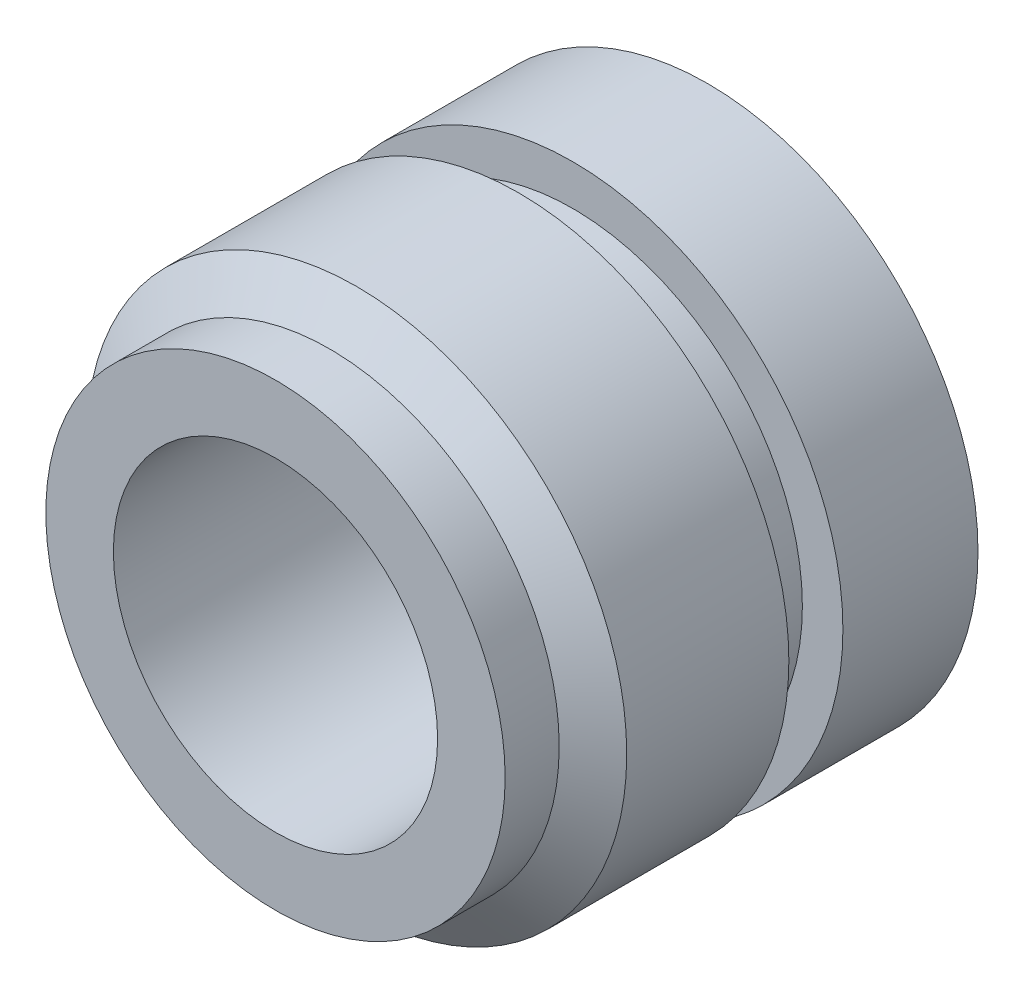
ISO-10303-21;
HEADER;
FILE_DESCRIPTION(('STEP AP214'),'2;1');
FILE_NAME('part.step','',(''),(''),'','','');
FILE_SCHEMA(('AUTOMOTIVE_DESIGN { 1 0 10303 214 1 1 1 1 }'));
ENDSEC;
DATA;
#1=APPLICATION_CONTEXT('core data for automotive mechanical design processes');
#2=APPLICATION_PROTOCOL_DEFINITION('international standard','automotive_design',2000,#1);
#3=PRODUCT_CONTEXT('',#1,'mechanical');
#4=PRODUCT('Part','Part','',(#3));
#5=PRODUCT_RELATED_PRODUCT_CATEGORY('part','',(#4));
#6=PRODUCT_DEFINITION_FORMATION('','',#4);
#7=PRODUCT_DEFINITION_CONTEXT('part definition',#1,'design');
#8=PRODUCT_DEFINITION('design','',#6,#7);
#9=PRODUCT_DEFINITION_SHAPE('','',#8);
#10=(LENGTH_UNIT() NAMED_UNIT(*) SI_UNIT(.MILLI.,.METRE.));
#11=(NAMED_UNIT(*) PLANE_ANGLE_UNIT() SI_UNIT($,.RADIAN.));
#12=(NAMED_UNIT(*) SI_UNIT($,.STERADIAN.) SOLID_ANGLE_UNIT());
#13=UNCERTAINTY_MEASURE_WITH_UNIT(LENGTH_MEASURE(1.E-05),#10,'distance_accuracy_value','');
#14=(GEOMETRIC_REPRESENTATION_CONTEXT(3) GLOBAL_UNCERTAINTY_ASSIGNED_CONTEXT((#13)) GLOBAL_UNIT_ASSIGNED_CONTEXT((#10,
#11,#12)) REPRESENTATION_CONTEXT('',''));
#15=CARTESIAN_POINT('',(0.,0.,0.));
#16=DIRECTION('',(0.,0.,1.));
#17=DIRECTION('',(1.,0.,0.));
#18=AXIS2_PLACEMENT_3D('',#15,#16,#17);
#19=CARTESIAN_POINT('',(0.,0.,4.));
#20=DIRECTION('',(0.,0.,-1.));
#21=DIRECTION('',(-1.,0.,0.));
#22=AXIS2_PLACEMENT_3D('',#19,#20,#21);
#23=CYLINDRICAL_SURFACE('',#22,2.5);
#24=CARTESIAN_POINT('',(0.,0.,0.));
#25=DIRECTION('',(0.,0.,1.));
#26=DIRECTION('',(1.,0.,0.));
#27=AXIS2_PLACEMENT_3D('',#24,#25,#26);
#28=CIRCLE('',#27,2.5);
#29=CARTESIAN_POINT('',(2.5,0.,0.));
#30=VERTEX_POINT('',#29);
#31=EDGE_CURVE('E50',#30,#30,#28,.T.);
#32=ORIENTED_EDGE('',*,*,#31,.T.);
#33=EDGE_LOOP('',(#32));
#34=FACE_BOUND('',#33,.T.);
#35=CARTESIAN_POINT('',(0.,0.,1.25));
#36=DIRECTION('',(0.,0.,1.));
#37=DIRECTION('',(1.,0.,0.));
#38=AXIS2_PLACEMENT_3D('',#35,#36,#37);
#39=CIRCLE('',#38,2.5);
#40=CARTESIAN_POINT('',(2.5,0.,1.25));
#41=VERTEX_POINT('',#40);
#42=EDGE_CURVE('E54',#41,#41,#39,.T.);
#43=ORIENTED_EDGE('',*,*,#42,.F.);
#44=EDGE_LOOP('',(#43));
#45=FACE_BOUND('',#44,.T.);
#46=ADVANCED_FACE('F38',(#34,#45),#23,.T.);
#47=CARTESIAN_POINT('',(0.,0.,0.));
#48=DIRECTION('',(0.,0.,1.));
#49=DIRECTION('',(1.,0.,0.));
#50=AXIS2_PLACEMENT_3D('',#47,#48,#49);
#51=PLANE('',#50);
#52=CARTESIAN_POINT('',(0.,0.,0.));
#53=DIRECTION('',(0.,0.,1.));
#54=DIRECTION('',(1.,0.,0.));
#55=AXIS2_PLACEMENT_3D('',#52,#53,#54);
#56=CIRCLE('',#55,1.6);
#57=CARTESIAN_POINT('',(1.6,0.,0.));
#58=VERTEX_POINT('',#57);
#59=EDGE_CURVE('E11',#58,#58,#56,.T.);
#60=ORIENTED_EDGE('',*,*,#59,.T.);
#61=EDGE_LOOP('',(#60));
#62=FACE_BOUND('',#61,.T.);
#63=ORIENTED_EDGE('',*,*,#31,.F.);
#64=EDGE_LOOP('',(#63));
#65=FACE_BOUND('',#64,.T.);
#66=ADVANCED_FACE('F99',(#62,#65),#51,.F.);
#67=CARTESIAN_POINT('',(-2.5,0.,1.25));
#68=DIRECTION('',(0.,0.,1.));
#69=DIRECTION('',(1.,0.,0.));
#70=AXIS2_PLACEMENT_3D('',#67,#68,#69);
#71=PLANE('',#70);
#72=ORIENTED_EDGE('',*,*,#42,.T.);
#73=EDGE_LOOP('',(#72));
#74=FACE_BOUND('',#73,.T.);
#75=CARTESIAN_POINT('',(0.,0.,1.25));
#76=DIRECTION('',(0.,0.,1.));
#77=DIRECTION('',(1.,0.,0.));
#78=AXIS2_PLACEMENT_3D('',#75,#76,#77);
#79=CIRCLE('',#78,2.125);
#80=CARTESIAN_POINT('',(2.125,0.,1.25));
#81=VERTEX_POINT('',#80);
#82=EDGE_CURVE('E63',#81,#81,#79,.T.);
#83=ORIENTED_EDGE('',*,*,#82,.F.);
#84=EDGE_LOOP('',(#83));
#85=FACE_BOUND('',#84,.T.);
#86=ADVANCED_FACE('F104',(#74,#85),#71,.T.);
#87=CARTESIAN_POINT('',(0.,0.,4.));
#88=DIRECTION('',(0.,0.,1.));
#89=DIRECTION('',(1.,0.,0.));
#90=AXIS2_PLACEMENT_3D('',#87,#88,#89);
#91=CYLINDRICAL_SURFACE('',#90,2.125);
#92=ORIENTED_EDGE('',*,*,#82,.T.);
#93=EDGE_LOOP('',(#92));
#94=FACE_BOUND('',#93,.T.);
#95=CARTESIAN_POINT('',(0.,0.,1.75));
#96=DIRECTION('',(0.,0.,1.));
#97=DIRECTION('',(1.,0.,0.));
#98=AXIS2_PLACEMENT_3D('',#95,#96,#97);
#99=CIRCLE('',#98,2.125);
#100=CARTESIAN_POINT('',(2.125,0.,1.75));
#101=VERTEX_POINT('',#100);
#102=EDGE_CURVE('E66',#101,#101,#99,.T.);
#103=ORIENTED_EDGE('',*,*,#102,.F.);
#104=EDGE_LOOP('',(#103));
#105=FACE_BOUND('',#104,.T.);
#106=ADVANCED_FACE('F114',(#94,#105),#91,.T.);
#107=CARTESIAN_POINT('',(-2.125,0.,1.75));
#108=DIRECTION('',(0.,0.,-1.));
#109=DIRECTION('',(-1.,0.,0.));
#110=AXIS2_PLACEMENT_3D('',#107,#108,#109);
#111=PLANE('',#110);
#112=ORIENTED_EDGE('',*,*,#102,.T.);
#113=EDGE_LOOP('',(#112));
#114=FACE_BOUND('',#113,.T.);
#115=CARTESIAN_POINT('',(0.,0.,1.75));
#116=DIRECTION('',(0.,0.,1.));
#117=DIRECTION('',(1.,0.,0.));
#118=AXIS2_PLACEMENT_3D('',#115,#116,#117);
#119=CIRCLE('',#118,2.5);
#120=CARTESIAN_POINT('',(2.5,0.,1.75));
#121=VERTEX_POINT('',#120);
#122=EDGE_CURVE('E69',#121,#121,#119,.T.);
#123=ORIENTED_EDGE('',*,*,#122,.F.);
#124=EDGE_LOOP('',(#123));
#125=FACE_BOUND('',#124,.T.);
#126=ADVANCED_FACE('F95',(#114,#125),#111,.T.);
#127=CARTESIAN_POINT('',(0.,0.,3.25));
#128=DIRECTION('',(0.,0.,1.));
#129=DIRECTION('',(1.,0.,0.));
#130=AXIS2_PLACEMENT_3D('',#127,#128,#129);
#131=CIRCLE('',#130,2.5);
#132=CARTESIAN_POINT('',(2.5,0.,3.25));
#133=VERTEX_POINT('',#132);
#134=EDGE_CURVE('E72',#133,#133,#131,.T.);
#135=ORIENTED_EDGE('',*,*,#134,.F.);
#136=EDGE_LOOP('',(#135));
#137=FACE_BOUND('',#136,.T.);
#138=ORIENTED_EDGE('',*,*,#122,.T.);
#139=EDGE_LOOP('',(#138));
#140=FACE_BOUND('',#139,.T.);
#141=ADVANCED_FACE('F86',(#137,#140),#23,.T.);
#142=CARTESIAN_POINT('',(0.,0.,4.));
#143=DIRECTION('',(0.,0.,1.));
#144=DIRECTION('',(1.,0.,0.));
#145=AXIS2_PLACEMENT_3D('',#142,#143,#144);
#146=CYLINDRICAL_SURFACE('',#145,2.125);
#147=CARTESIAN_POINT('',(0.,0.,3.5));
#148=DIRECTION('',(0.,0.,1.));
#149=DIRECTION('',(1.,0.,0.));
#150=AXIS2_PLACEMENT_3D('',#147,#148,#149);
#151=CIRCLE('',#150,2.125);
#152=CARTESIAN_POINT('',(2.125,0.,3.5));
#153=VERTEX_POINT('',#152);
#154=EDGE_CURVE('E75',#153,#153,#151,.T.);
#155=ORIENTED_EDGE('',*,*,#154,.T.);
#156=EDGE_LOOP('',(#155));
#157=FACE_BOUND('',#156,.T.);
#158=CARTESIAN_POINT('',(0.,0.,4.));
#159=DIRECTION('',(0.,0.,1.));
#160=DIRECTION('',(1.,0.,0.));
#161=AXIS2_PLACEMENT_3D('',#158,#159,#160);
#162=CIRCLE('',#161,2.125);
#163=CARTESIAN_POINT('',(2.125,0.,4.));
#164=VERTEX_POINT('',#163);
#165=EDGE_CURVE('E59',#164,#164,#162,.T.);
#166=ORIENTED_EDGE('',*,*,#165,.F.);
#167=EDGE_LOOP('',(#166));
#168=FACE_BOUND('',#167,.T.);
#169=ADVANCED_FACE('F83',(#157,#168),#146,.T.);
#170=CARTESIAN_POINT('',(0.,0.,3.5));
#171=DIRECTION('',(0.,0.,-1.));
#172=DIRECTION('',(-1.,0.,0.));
#173=AXIS2_PLACEMENT_3D('',#170,#171,#172);
#174=CONICAL_SURFACE('',#173,2.125,0.982793723247329);
#175=ORIENTED_EDGE('',*,*,#134,.T.);
#176=EDGE_LOOP('',(#175));
#177=FACE_BOUND('',#176,.T.);
#178=ORIENTED_EDGE('',*,*,#154,.F.);
#179=EDGE_LOOP('',(#178));
#180=FACE_BOUND('',#179,.T.);
#181=ADVANCED_FACE('F85',(#177,#180),#174,.T.);
#182=CARTESIAN_POINT('',(0.,0.,4.));
#183=DIRECTION('',(0.,0.,1.));
#184=DIRECTION('',(1.,0.,0.));
#185=AXIS2_PLACEMENT_3D('',#182,#183,#184);
#186=PLANE('',#185);
#187=CARTESIAN_POINT('',(0.,0.,4.));
#188=DIRECTION('',(0.,0.,1.));
#189=DIRECTION('',(1.,0.,0.));
#190=AXIS2_PLACEMENT_3D('',#187,#188,#189);
#191=CIRCLE('',#190,1.5);
#192=CARTESIAN_POINT('',(1.5,0.,4.));
#193=VERTEX_POINT('',#192);
#194=EDGE_CURVE('E57',#193,#193,#191,.T.);
#195=ORIENTED_EDGE('',*,*,#194,.F.);
#196=EDGE_LOOP('',(#195));
#197=FACE_BOUND('',#196,.T.);
#198=ORIENTED_EDGE('',*,*,#165,.T.);
#199=EDGE_LOOP('',(#198));
#200=FACE_BOUND('',#199,.T.);
#201=ADVANCED_FACE('F81',(#197,#200),#186,.T.);
#202=CARTESIAN_POINT('',(0.,0.,5.));
#203=DIRECTION('',(0.,0.,-1.));
#204=DIRECTION('',(-1.,0.,0.));
#205=AXIS2_PLACEMENT_3D('',#202,#203,#204);
#206=CYLINDRICAL_SURFACE('',#205,1.5);
#207=CARTESIAN_POINT('',(0.,0.,0.0999999999999985));
#208=DIRECTION('',(0.,0.,1.));
#209=DIRECTION('',(1.,0.,0.));
#210=AXIS2_PLACEMENT_3D('',#207,#208,#209);
#211=CIRCLE('',#210,1.5);
#212=CARTESIAN_POINT('',(1.5,0.,0.0999999999999985));
#213=VERTEX_POINT('',#212);
#214=EDGE_CURVE('E46',#213,#213,#211,.F.);
#215=ORIENTED_EDGE('',*,*,#214,.T.);
#216=EDGE_LOOP('',(#215));
#217=FACE_BOUND('',#216,.T.);
#218=ORIENTED_EDGE('',*,*,#194,.T.);
#219=EDGE_LOOP('',(#218));
#220=FACE_BOUND('',#219,.T.);
#221=ADVANCED_FACE('F110',(#217,#220),#206,.F.);
#222=CARTESIAN_POINT('',(0.,0.,0.0999999999999985));
#223=DIRECTION('',(0.,0.,-1.));
#224=DIRECTION('',(-1.,0.,0.));
#225=AXIS2_PLACEMENT_3D('',#222,#223,#224);
#226=CONICAL_SURFACE('',#225,1.5,0.78539816339745);
#227=ORIENTED_EDGE('',*,*,#59,.F.);
#228=EDGE_LOOP('',(#227));
#229=FACE_BOUND('',#228,.T.);
#230=ORIENTED_EDGE('',*,*,#214,.F.);
#231=EDGE_LOOP('',(#230));
#232=FACE_BOUND('',#231,.T.);
#233=ADVANCED_FACE('F41',(#229,#232),#226,.F.);
#234=CLOSED_SHELL('',(#46,#66,#86,#106,#126,#141,#169,#181,#201,#221,#233));
#235=MANIFOLD_SOLID_BREP('B2',#234);
#236=ADVANCED_BREP_SHAPE_REPRESENTATION('',(#18,#235),#14);
#237=SHAPE_DEFINITION_REPRESENTATION(#9,#236);
ENDSEC;
END-ISO-10303-21;
